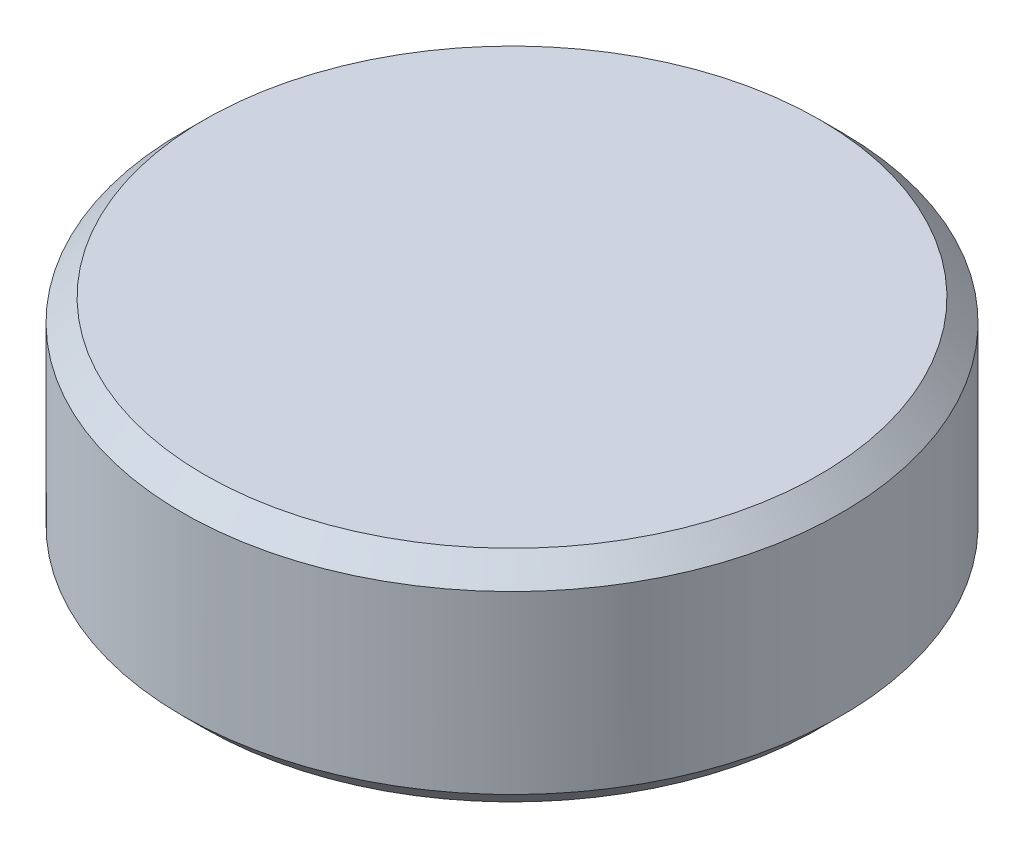
ISO-10303-21;
HEADER;
FILE_DESCRIPTION(('STEP AP214'),'2;1');
FILE_NAME('part.step','',(''),(''),'','','');
FILE_SCHEMA(('AUTOMOTIVE_DESIGN { 1 0 10303 214 1 1 1 1 }'));
ENDSEC;
DATA;
#1=APPLICATION_CONTEXT('core data for automotive mechanical design processes');
#2=APPLICATION_PROTOCOL_DEFINITION('international standard','automotive_design',2000,#1);
#3=PRODUCT_CONTEXT('',#1,'mechanical');
#4=PRODUCT('Part','Part','',(#3));
#5=PRODUCT_RELATED_PRODUCT_CATEGORY('part','',(#4));
#6=PRODUCT_DEFINITION_FORMATION('','',#4);
#7=PRODUCT_DEFINITION_CONTEXT('part definition',#1,'design');
#8=PRODUCT_DEFINITION('design','',#6,#7);
#9=PRODUCT_DEFINITION_SHAPE('','',#8);
#10=(LENGTH_UNIT() NAMED_UNIT(*) SI_UNIT(.MILLI.,.METRE.));
#11=(NAMED_UNIT(*) PLANE_ANGLE_UNIT() SI_UNIT($,.RADIAN.));
#12=(NAMED_UNIT(*) SI_UNIT($,.STERADIAN.) SOLID_ANGLE_UNIT());
#13=UNCERTAINTY_MEASURE_WITH_UNIT(LENGTH_MEASURE(1.E-05),#10,'distance_accuracy_value','');
#14=(GEOMETRIC_REPRESENTATION_CONTEXT(3) GLOBAL_UNCERTAINTY_ASSIGNED_CONTEXT((#13)) GLOBAL_UNIT_ASSIGNED_CONTEXT((#10,
#11,#12)) REPRESENTATION_CONTEXT('',''));
#15=CARTESIAN_POINT('',(0.,0.,0.));
#16=DIRECTION('',(0.,0.,1.));
#17=DIRECTION('',(1.,0.,0.));
#18=AXIS2_PLACEMENT_3D('',#15,#16,#17);
#19=CARTESIAN_POINT('',(0.,2.,0.));
#20=DIRECTION('',(0.,-1.,0.));
#21=DIRECTION('',(0.,0.,-1.));
#22=AXIS2_PLACEMENT_3D('',#19,#20,#21);
#23=CYLINDRICAL_SURFACE('',#22,3.);
#24=CARTESIAN_POINT('',(0.,0.2,0.));
#25=DIRECTION('',(0.,1.,0.));
#26=DIRECTION('',(0.,0.,1.));
#27=AXIS2_PLACEMENT_3D('',#24,#25,#26);
#28=CIRCLE('',#27,3.);
#29=CARTESIAN_POINT('',(0.,0.2,3.));
#30=VERTEX_POINT('',#29);
#31=EDGE_CURVE('E46',#30,#30,#28,.T.);
#32=ORIENTED_EDGE('',*,*,#31,.T.);
#33=EDGE_LOOP('',(#32));
#34=FACE_BOUND('',#33,.T.);
#35=CARTESIAN_POINT('',(0.,1.8,0.));
#36=DIRECTION('',(0.,1.,0.));
#37=DIRECTION('',(0.,0.,1.));
#38=AXIS2_PLACEMENT_3D('',#35,#36,#37);
#39=CIRCLE('',#38,3.);
#40=CARTESIAN_POINT('',(0.,1.79999999999999,-3.));
#41=VERTEX_POINT('',#40);
#42=EDGE_CURVE('E50',#41,#41,#39,.F.);
#43=ORIENTED_EDGE('',*,*,#42,.T.);
#44=EDGE_LOOP('',(#43));
#45=FACE_BOUND('',#44,.T.);
#46=ADVANCED_FACE('F34',(#34,#45),#23,.T.);
#47=CARTESIAN_POINT('',(0.,2.,0.));
#48=DIRECTION('',(0.,1.,0.));
#49=DIRECTION('',(0.,0.,1.));
#50=AXIS2_PLACEMENT_3D('',#47,#48,#49);
#51=PLANE('',#50);
#52=CARTESIAN_POINT('',(0.,2.,0.));
#53=DIRECTION('',(0.,1.,0.));
#54=DIRECTION('',(0.,0.,1.));
#55=AXIS2_PLACEMENT_3D('',#52,#53,#54);
#56=CIRCLE('',#55,2.8);
#57=CARTESIAN_POINT('',(0.,2.,-2.8));
#58=VERTEX_POINT('',#57);
#59=EDGE_CURVE('E10',#58,#58,#56,.T.);
#60=ORIENTED_EDGE('',*,*,#59,.T.);
#61=EDGE_LOOP('',(#60));
#62=FACE_BOUND('',#61,.T.);
#63=ADVANCED_FACE('F66',(#62),#51,.T.);
#64=CARTESIAN_POINT('',(0.,0.,0.));
#65=DIRECTION('',(0.,1.,0.));
#66=DIRECTION('',(0.,0.,1.));
#67=AXIS2_PLACEMENT_3D('',#64,#65,#66);
#68=PLANE('',#67);
#69=CARTESIAN_POINT('',(0.,0.,0.));
#70=DIRECTION('',(0.,1.,0.));
#71=DIRECTION('',(0.,0.,1.));
#72=AXIS2_PLACEMENT_3D('',#69,#70,#71);
#73=CIRCLE('',#72,2.8);
#74=CARTESIAN_POINT('',(0.,0.,2.8));
#75=VERTEX_POINT('',#74);
#76=EDGE_CURVE('E42',#75,#75,#73,.F.);
#77=ORIENTED_EDGE('',*,*,#76,.T.);
#78=EDGE_LOOP('',(#77));
#79=FACE_BOUND('',#78,.T.);
#80=ADVANCED_FACE('F63',(#79),#68,.F.);
#81=CARTESIAN_POINT('',(0.,0.2,0.));
#82=DIRECTION('',(0.,1.,0.));
#83=DIRECTION('',(0.,0.,1.));
#84=AXIS2_PLACEMENT_3D('',#81,#82,#83);
#85=CONICAL_SURFACE('',#84,3.,0.78539816339745);
#86=ORIENTED_EDGE('',*,*,#76,.F.);
#87=EDGE_LOOP('',(#86));
#88=FACE_BOUND('',#87,.T.);
#89=ORIENTED_EDGE('',*,*,#31,.F.);
#90=EDGE_LOOP('',(#89));
#91=FACE_BOUND('',#90,.T.);
#92=ADVANCED_FACE('F59',(#88,#91),#85,.T.);
#93=CARTESIAN_POINT('',(0.,2.,0.));
#94=DIRECTION('',(0.,-1.,0.));
#95=DIRECTION('',(0.,0.,-1.));
#96=AXIS2_PLACEMENT_3D('',#93,#94,#95);
#97=CONICAL_SURFACE('',#96,2.8,0.785398163397446);
#98=CARTESIAN_POINT('',(0.,1.79999999999999,-3.));
#99=CARTESIAN_POINT('',(0.,1.80208333333333,-2.99791666666667));
#100=CARTESIAN_POINT('',(0.,1.80416666666666,-2.99583333333333));
#101=CARTESIAN_POINT('',(0.,1.80833333333333,-2.99166666666667));
#102=CARTESIAN_POINT('',(0.,1.81041666666666,-2.98958333333333));
#103=CARTESIAN_POINT('',(0.,1.81458333333333,-2.98541666666667));
#104=CARTESIAN_POINT('',(0.,1.81666666666666,-2.98333333333333));
#105=CARTESIAN_POINT('',(0.,1.82083333333333,-2.97916666666667));
#106=CARTESIAN_POINT('',(0.,1.82291666666666,-2.97708333333333));
#107=CARTESIAN_POINT('',(0.,1.82708333333333,-2.97291666666667));
#108=CARTESIAN_POINT('',(0.,1.82916666666666,-2.97083333333333));
#109=CARTESIAN_POINT('',(0.,1.83333333333333,-2.96666666666667));
#110=CARTESIAN_POINT('',(0.,1.83541666666666,-2.96458333333333));
#111=CARTESIAN_POINT('',(0.,1.83958333333333,-2.96041666666667));
#112=CARTESIAN_POINT('',(0.,1.84166666666666,-2.95833333333333));
#113=CARTESIAN_POINT('',(0.,1.84583333333333,-2.95416666666667));
#114=CARTESIAN_POINT('',(0.,1.84791666666666,-2.95208333333333));
#115=CARTESIAN_POINT('',(0.,1.85208333333333,-2.94791666666667));
#116=CARTESIAN_POINT('',(0.,1.85416666666666,-2.94583333333333));
#117=CARTESIAN_POINT('',(0.,1.85833333333333,-2.94166666666667));
#118=CARTESIAN_POINT('',(0.,1.86041666666666,-2.93958333333333));
#119=CARTESIAN_POINT('',(0.,1.86458333333333,-2.93541666666667));
#120=CARTESIAN_POINT('',(0.,1.86666666666666,-2.93333333333333));
#121=CARTESIAN_POINT('',(0.,1.87083333333333,-2.92916666666667));
#122=CARTESIAN_POINT('',(0.,1.87291666666666,-2.92708333333333));
#123=CARTESIAN_POINT('',(0.,1.87708333333333,-2.92291666666667));
#124=CARTESIAN_POINT('',(0.,1.87916666666666,-2.92083333333333));
#125=CARTESIAN_POINT('',(0.,1.88333333333333,-2.91666666666667));
#126=CARTESIAN_POINT('',(0.,1.88541666666666,-2.91458333333333));
#127=CARTESIAN_POINT('',(0.,1.88958333333333,-2.91041666666667));
#128=CARTESIAN_POINT('',(0.,1.89166666666666,-2.90833333333333));
#129=CARTESIAN_POINT('',(0.,1.89583333333333,-2.90416666666667));
#130=CARTESIAN_POINT('',(0.,1.89791666666666,-2.90208333333333));
#131=CARTESIAN_POINT('',(0.,1.90208333333333,-2.89791666666667));
#132=CARTESIAN_POINT('',(0.,1.90416666666666,-2.89583333333333));
#133=CARTESIAN_POINT('',(0.,1.90833333333333,-2.89166666666667));
#134=CARTESIAN_POINT('',(0.,1.91041666666666,-2.88958333333333));
#135=CARTESIAN_POINT('',(0.,1.91458333333333,-2.88541666666667));
#136=CARTESIAN_POINT('',(0.,1.91666666666666,-2.88333333333333));
#137=CARTESIAN_POINT('',(0.,1.92083333333333,-2.87916666666666));
#138=CARTESIAN_POINT('',(0.,1.92291666666666,-2.87708333333333));
#139=CARTESIAN_POINT('',(0.,1.92708333333333,-2.87291666666666));
#140=CARTESIAN_POINT('',(0.,1.92916666666666,-2.87083333333333));
#141=CARTESIAN_POINT('',(0.,1.93333333333333,-2.86666666666666));
#142=CARTESIAN_POINT('',(0.,1.93541666666667,-2.86458333333333));
#143=CARTESIAN_POINT('',(0.,1.93958333333333,-2.86041666666666));
#144=CARTESIAN_POINT('',(0.,1.94166666666667,-2.85833333333333));
#145=CARTESIAN_POINT('',(0.,1.94583333333333,-2.85416666666666));
#146=CARTESIAN_POINT('',(0.,1.94791666666666,-2.85208333333333));
#147=CARTESIAN_POINT('',(0.,1.95208333333333,-2.84791666666666));
#148=CARTESIAN_POINT('',(0.,1.95416666666667,-2.84583333333333));
#149=CARTESIAN_POINT('',(0.,1.95833333333333,-2.84166666666666));
#150=CARTESIAN_POINT('',(0.,1.96041666666667,-2.83958333333333));
#151=CARTESIAN_POINT('',(0.,1.96458333333333,-2.83541666666666));
#152=CARTESIAN_POINT('',(0.,1.96666666666667,-2.83333333333333));
#153=CARTESIAN_POINT('',(0.,1.97083333333333,-2.82916666666666));
#154=CARTESIAN_POINT('',(0.,1.97291666666667,-2.82708333333333));
#155=CARTESIAN_POINT('',(0.,1.97708333333333,-2.82291666666666));
#156=CARTESIAN_POINT('',(0.,1.97916666666667,-2.82083333333333));
#157=CARTESIAN_POINT('',(0.,1.98333333333333,-2.81666666666666));
#158=CARTESIAN_POINT('',(0.,1.98541666666667,-2.81458333333333));
#159=CARTESIAN_POINT('',(0.,1.98958333333333,-2.81041666666666));
#160=CARTESIAN_POINT('',(0.,1.99166666666667,-2.80833333333333));
#161=CARTESIAN_POINT('',(0.,1.99583333333333,-2.80416666666666));
#162=CARTESIAN_POINT('',(0.,1.99791666666667,-2.80208333333333));
#163=CARTESIAN_POINT('',(0.,2.,-2.8));
#164=B_SPLINE_CURVE_WITH_KNOTS('',3,(#98,#99,#100,#101,#102,#103,#104,#105,#106,#107,#108,#109,
#110,#111,#112,#113,#114,#115,#116,#117,#118,#119,#120,#121,#122,#123,#124,#125,#126,#127,#128,
#129,#130,#131,#132,#133,#134,#135,#136,#137,#138,#139,#140,#141,#142,#143,#144,#145,#146,#147,
#148,#149,#150,#151,#152,#153,#154,#155,#156,#157,#158,#159,#160,#161,#162,#163),.UNSPECIFIED.,
.F.,.F.,(4,2,2,2,2,2,2,2,2,2,2,2,2,2,2,2,2,2,2,2,2,2,2,2,2,2,2,2,2,2,2,2,4),(0.,
0.0088388347648321,0.0176776695296639,0.026516504294496,0.0353553390593281,0.0441941738241602,
0.0530330085889923,0.0618718433538242,0.0707106781186563,0.0795495128834884,0.0883883476483202,
0.0972271824131523,0.106066017177984,0.114904851942817,0.123743686707648,0.132582521472481,
0.141421356237313,0.150260191002144,0.159099025766977,0.167937860531809,0.176776695296641,
0.185615530061473,0.194454364826305,0.203293199591137,0.212132034355969,0.220970869120801,
0.229809703885633,0.238648538650465,0.247487373415297,0.256326208180129,0.265165042944961,
0.274003877709793,0.282842712474625),.UNSPECIFIED.);
#165=EDGE_CURVE('BSEAM37',#41,#58,#164,.T.);
#166=ORIENTED_EDGE('',*,*,#42,.F.);
#167=ORIENTED_EDGE('',*,*,#59,.F.);
#168=ORIENTED_EDGE('',*,*,#165,.T.);
#169=ORIENTED_EDGE('',*,*,#165,.F.);
#170=EDGE_LOOP('',(#166,#168,#167,#169));
#171=FACE_BOUND('',#170,.T.);
#172=ADVANCED_FACE('F37',(#171),#97,.T.);
#173=CLOSED_SHELL('',(#46,#63,#80,#92,#172));
#174=MANIFOLD_SOLID_BREP('B2',#173);
#175=ADVANCED_BREP_SHAPE_REPRESENTATION('',(#18,#174),#14);
#176=SHAPE_DEFINITION_REPRESENTATION(#9,#175);
ENDSEC;
END-ISO-10303-21;
